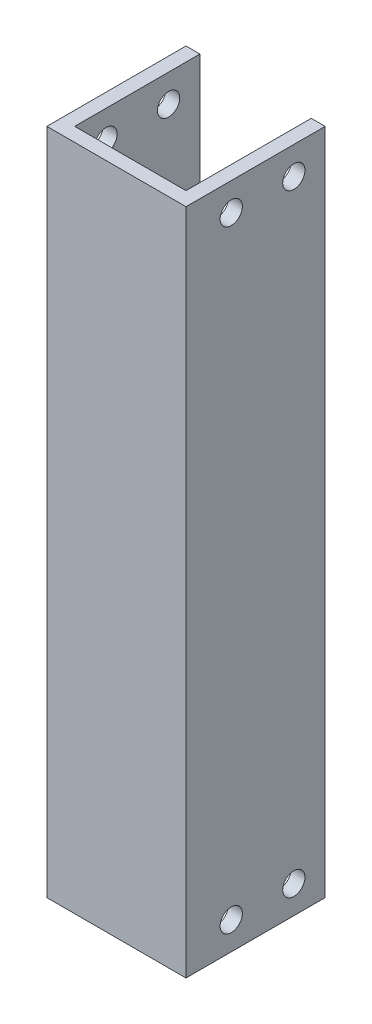
ISO-10303-21;
HEADER;
FILE_DESCRIPTION(('STEP AP214'),'2;1');
FILE_NAME('part.step','',(''),(''),'','','');
FILE_SCHEMA(('AUTOMOTIVE_DESIGN { 1 0 10303 214 1 1 1 1 }'));
ENDSEC;
DATA;
#1=APPLICATION_CONTEXT('core data for automotive mechanical design processes');
#2=APPLICATION_PROTOCOL_DEFINITION('international standard','automotive_design',2000,#1);
#3=PRODUCT_CONTEXT('',#1,'mechanical');
#4=PRODUCT('Part','Part','',(#3));
#5=PRODUCT_RELATED_PRODUCT_CATEGORY('part','',(#4));
#6=PRODUCT_DEFINITION_FORMATION('','',#4);
#7=PRODUCT_DEFINITION_CONTEXT('part definition',#1,'design');
#8=PRODUCT_DEFINITION('design','',#6,#7);
#9=PRODUCT_DEFINITION_SHAPE('','',#8);
#10=(LENGTH_UNIT() NAMED_UNIT(*) SI_UNIT(.MILLI.,.METRE.));
#11=(NAMED_UNIT(*) PLANE_ANGLE_UNIT() SI_UNIT($,.RADIAN.));
#12=(NAMED_UNIT(*) SI_UNIT($,.STERADIAN.) SOLID_ANGLE_UNIT());
#13=UNCERTAINTY_MEASURE_WITH_UNIT(LENGTH_MEASURE(1.E-05),#10,'distance_accuracy_value','');
#14=(GEOMETRIC_REPRESENTATION_CONTEXT(3) GLOBAL_UNCERTAINTY_ASSIGNED_CONTEXT((#13)) GLOBAL_UNIT_ASSIGNED_CONTEXT((#10,
#11,#12)) REPRESENTATION_CONTEXT('',''));
#15=CARTESIAN_POINT('',(0.,0.,0.));
#16=DIRECTION('',(0.,0.,1.));
#17=DIRECTION('',(1.,0.,0.));
#18=AXIS2_PLACEMENT_3D('',#15,#16,#17);
#19=CARTESIAN_POINT('',(0.,152.4,0.));
#20=DIRECTION('',(1.,0.,0.));
#21=DIRECTION('',(0.,0.,-1.));
#22=AXIS2_PLACEMENT_3D('',#19,#20,#21);
#23=PLANE('',#22);
#24=CARTESIAN_POINT('',(0.,146.05,-24.60625));
#25=DIRECTION('',(1.,0.,0.));
#26=DIRECTION('',(0.,0.,-1.));
#27=AXIS2_PLACEMENT_3D('',#24,#25,#26);
#28=CIRCLE('',#27,2.54);
#29=CARTESIAN_POINT('',(0.,146.05,-27.14625));
#30=VERTEX_POINT('',#29);
#31=EDGE_CURVE('E165',#30,#30,#28,.T.);
#32=ORIENTED_EDGE('',*,*,#31,.T.);
#33=EDGE_LOOP('',(#32));
#34=FACE_BOUND('',#33,.T.);
#35=CARTESIAN_POINT('',(0.,6.35,-10.31875));
#36=DIRECTION('',(1.,0.,0.));
#37=DIRECTION('',(0.,0.,-1.));
#38=AXIS2_PLACEMENT_3D('',#35,#36,#37);
#39=CIRCLE('',#38,2.54);
#40=CARTESIAN_POINT('',(0.,6.35,-12.85875));
#41=VERTEX_POINT('',#40);
#42=EDGE_CURVE('E237',#41,#41,#39,.T.);
#43=ORIENTED_EDGE('',*,*,#42,.T.);
#44=EDGE_LOOP('',(#43));
#45=FACE_BOUND('',#44,.T.);
#46=CARTESIAN_POINT('',(0.,146.05,-10.31875));
#47=DIRECTION('',(1.,0.,0.));
#48=DIRECTION('',(0.,0.,-1.));
#49=AXIS2_PLACEMENT_3D('',#46,#47,#48);
#50=CIRCLE('',#49,2.54);
#51=CARTESIAN_POINT('',(0.,146.05,-12.85875));
#52=VERTEX_POINT('',#51);
#53=EDGE_CURVE('E241',#52,#52,#50,.T.);
#54=ORIENTED_EDGE('',*,*,#53,.T.);
#55=EDGE_LOOP('',(#54));
#56=FACE_BOUND('',#55,.T.);
#57=CARTESIAN_POINT('',(0.,6.35,-24.60625));
#58=DIRECTION('',(1.,0.,0.));
#59=DIRECTION('',(0.,0.,-1.));
#60=AXIS2_PLACEMENT_3D('',#57,#58,#59);
#61=CIRCLE('',#60,2.54);
#62=CARTESIAN_POINT('',(0.,6.35,-27.14625));
#63=VERTEX_POINT('',#62);
#64=EDGE_CURVE('E161',#63,#63,#61,.T.);
#65=ORIENTED_EDGE('',*,*,#64,.T.);
#66=EDGE_LOOP('',(#65));
#67=FACE_BOUND('',#66,.T.);
#68=DIRECTION('',(0.,0.,1.));
#69=VECTOR('',#68,1.);
#70=CARTESIAN_POINT('',(0.,0.,0.));
#71=LINE('',#70,#69);
#72=CARTESIAN_POINT('',(0.,0.,-31.75));
#73=VERTEX_POINT('',#72);
#74=CARTESIAN_POINT('',(0.,0.,0.));
#75=VERTEX_POINT('',#74);
#76=EDGE_CURVE('E131',#73,#75,#71,.T.);
#77=ORIENTED_EDGE('',*,*,#76,.T.);
#78=DIRECTION('',(0.,-1.,0.));
#79=VECTOR('',#78,1.);
#80=CARTESIAN_POINT('',(0.,152.4,0.));
#81=LINE('',#80,#79);
#82=CARTESIAN_POINT('',(0.,152.4,0.));
#83=VERTEX_POINT('',#82);
#84=EDGE_CURVE('E11',#83,#75,#81,.T.);
#85=ORIENTED_EDGE('',*,*,#84,.F.);
#86=DIRECTION('',(0.,0.,1.));
#87=VECTOR('',#86,1.);
#88=CARTESIAN_POINT('',(0.,152.4,0.));
#89=LINE('',#88,#87);
#90=CARTESIAN_POINT('',(0.,152.4,-31.75));
#91=VERTEX_POINT('',#90);
#92=EDGE_CURVE('E146',#91,#83,#89,.T.);
#93=ORIENTED_EDGE('',*,*,#92,.F.);
#94=DIRECTION('',(0.,-1.,0.));
#95=VECTOR('',#94,1.);
#96=CARTESIAN_POINT('',(0.,152.4,-31.75));
#97=LINE('',#96,#95);
#98=EDGE_CURVE('E127',#91,#73,#97,.T.);
#99=ORIENTED_EDGE('',*,*,#98,.T.);
#100=EDGE_LOOP('',(#77,#85,#93,#99));
#101=FACE_BOUND('',#100,.T.);
#102=ADVANCED_FACE('F33',(#34,#45,#56,#67,#101),#23,.F.);
#103=CARTESIAN_POINT('',(0.,152.4,0.));
#104=DIRECTION('',(0.,0.,-1.));
#105=DIRECTION('',(-1.,0.,0.));
#106=AXIS2_PLACEMENT_3D('',#103,#104,#105);
#107=PLANE('',#106);
#108=DIRECTION('',(1.,0.,0.));
#109=VECTOR('',#108,1.);
#110=CARTESIAN_POINT('',(0.,0.,0.));
#111=LINE('',#110,#109);
#112=CARTESIAN_POINT('',(31.75,0.,0.));
#113=VERTEX_POINT('',#112);
#114=EDGE_CURVE('E134',#75,#113,#111,.T.);
#115=ORIENTED_EDGE('',*,*,#114,.T.);
#116=DIRECTION('',(0.,-1.,0.));
#117=VECTOR('',#116,1.);
#118=CARTESIAN_POINT('',(31.75,152.4,0.));
#119=LINE('',#118,#117);
#120=CARTESIAN_POINT('',(31.75,152.4,0.));
#121=VERTEX_POINT('',#120);
#122=EDGE_CURVE('E42',#121,#113,#119,.T.);
#123=ORIENTED_EDGE('',*,*,#122,.F.);
#124=DIRECTION('',(1.,0.,0.));
#125=VECTOR('',#124,1.);
#126=CARTESIAN_POINT('',(0.,152.4,0.));
#127=LINE('',#126,#125);
#128=EDGE_CURVE('E94',#83,#121,#127,.T.);
#129=ORIENTED_EDGE('',*,*,#128,.F.);
#130=ORIENTED_EDGE('',*,*,#84,.T.);
#131=EDGE_LOOP('',(#115,#123,#129,#130));
#132=FACE_BOUND('',#131,.T.);
#133=ADVANCED_FACE('F225',(#132),#107,.F.);
#134=CARTESIAN_POINT('',(31.75,152.4,0.));
#135=DIRECTION('',(-1.,0.,0.));
#136=DIRECTION('',(0.,0.,1.));
#137=AXIS2_PLACEMENT_3D('',#134,#135,#136);
#138=PLANE('',#137);
#139=CARTESIAN_POINT('',(31.75,146.05,-24.60625));
#140=DIRECTION('',(1.,0.,0.));
#141=DIRECTION('',(0.,0.,-1.));
#142=AXIS2_PLACEMENT_3D('',#139,#140,#141);
#143=CIRCLE('',#142,2.54);
#144=CARTESIAN_POINT('',(31.75,146.05,-27.14625));
#145=VERTEX_POINT('',#144);
#146=EDGE_CURVE('E297',#145,#145,#143,.T.);
#147=ORIENTED_EDGE('',*,*,#146,.F.);
#148=EDGE_LOOP('',(#147));
#149=FACE_BOUND('',#148,.T.);
#150=CARTESIAN_POINT('',(31.75,6.35,-10.31875));
#151=DIRECTION('',(1.,0.,0.));
#152=DIRECTION('',(0.,0.,-1.));
#153=AXIS2_PLACEMENT_3D('',#150,#151,#152);
#154=CIRCLE('',#153,2.54);
#155=CARTESIAN_POINT('',(31.75,6.35,-12.85875));
#156=VERTEX_POINT('',#155);
#157=EDGE_CURVE('E291',#156,#156,#154,.T.);
#158=ORIENTED_EDGE('',*,*,#157,.F.);
#159=EDGE_LOOP('',(#158));
#160=FACE_BOUND('',#159,.T.);
#161=CARTESIAN_POINT('',(31.75,146.05,-10.31875));
#162=DIRECTION('',(1.,0.,0.));
#163=DIRECTION('',(0.,0.,-1.));
#164=AXIS2_PLACEMENT_3D('',#161,#162,#163);
#165=CIRCLE('',#164,2.54);
#166=CARTESIAN_POINT('',(31.75,146.05,-12.85875));
#167=VERTEX_POINT('',#166);
#168=EDGE_CURVE('E178',#167,#167,#165,.T.);
#169=ORIENTED_EDGE('',*,*,#168,.F.);
#170=EDGE_LOOP('',(#169));
#171=FACE_BOUND('',#170,.T.);
#172=CARTESIAN_POINT('',(31.75,6.35,-24.60625));
#173=DIRECTION('',(1.,0.,0.));
#174=DIRECTION('',(0.,0.,-1.));
#175=AXIS2_PLACEMENT_3D('',#172,#173,#174);
#176=CIRCLE('',#175,2.54);
#177=CARTESIAN_POINT('',(31.75,6.35,-27.14625));
#178=VERTEX_POINT('',#177);
#179=EDGE_CURVE('E184',#178,#178,#176,.T.);
#180=ORIENTED_EDGE('',*,*,#179,.F.);
#181=EDGE_LOOP('',(#180));
#182=FACE_BOUND('',#181,.T.);
#183=DIRECTION('',(0.,0.,-1.));
#184=VECTOR('',#183,1.);
#185=CARTESIAN_POINT('',(31.75,0.,0.));
#186=LINE('',#185,#184);
#187=CARTESIAN_POINT('',(31.75,0.,-31.75));
#188=VERTEX_POINT('',#187);
#189=EDGE_CURVE('E137',#113,#188,#186,.T.);
#190=ORIENTED_EDGE('',*,*,#189,.T.);
#191=DIRECTION('',(0.,-1.,0.));
#192=VECTOR('',#191,1.);
#193=CARTESIAN_POINT('',(31.75,152.4,-31.75));
#194=LINE('',#193,#192);
#195=CARTESIAN_POINT('',(31.75,152.4,-31.75));
#196=VERTEX_POINT('',#195);
#197=EDGE_CURVE('E153',#196,#188,#194,.T.);
#198=ORIENTED_EDGE('',*,*,#197,.F.);
#199=DIRECTION('',(0.,0.,-1.));
#200=VECTOR('',#199,1.);
#201=CARTESIAN_POINT('',(31.75,152.4,0.));
#202=LINE('',#201,#200);
#203=EDGE_CURVE('E193',#121,#196,#202,.T.);
#204=ORIENTED_EDGE('',*,*,#203,.F.);
#205=ORIENTED_EDGE('',*,*,#122,.T.);
#206=EDGE_LOOP('',(#190,#198,#204,#205));
#207=FACE_BOUND('',#206,.T.);
#208=ADVANCED_FACE('F230',(#149,#160,#171,#182,#207),#138,.F.);
#209=CARTESIAN_POINT('',(31.75,152.4,-31.75));
#210=DIRECTION('',(0.,0.,1.));
#211=DIRECTION('',(1.,0.,0.));
#212=AXIS2_PLACEMENT_3D('',#209,#210,#211);
#213=PLANE('',#212);
#214=DIRECTION('',(-1.,0.,0.));
#215=VECTOR('',#214,1.);
#216=CARTESIAN_POINT('',(31.75,0.,-31.75));
#217=LINE('',#216,#215);
#218=CARTESIAN_POINT('',(28.575,0.,-31.75));
#219=VERTEX_POINT('',#218);
#220=EDGE_CURVE('E139',#188,#219,#217,.T.);
#221=ORIENTED_EDGE('',*,*,#220,.T.);
#222=DIRECTION('',(0.,-1.,0.));
#223=VECTOR('',#222,1.);
#224=CARTESIAN_POINT('',(28.575,152.4,-31.75));
#225=LINE('',#224,#223);
#226=CARTESIAN_POINT('',(28.575,152.4,-31.75));
#227=VERTEX_POINT('',#226);
#228=EDGE_CURVE('E150',#227,#219,#225,.T.);
#229=ORIENTED_EDGE('',*,*,#228,.F.);
#230=DIRECTION('',(-1.,0.,0.));
#231=VECTOR('',#230,1.);
#232=CARTESIAN_POINT('',(31.75,152.4,-31.75));
#233=LINE('',#232,#231);
#234=EDGE_CURVE('E195',#196,#227,#233,.T.);
#235=ORIENTED_EDGE('',*,*,#234,.F.);
#236=ORIENTED_EDGE('',*,*,#197,.T.);
#237=EDGE_LOOP('',(#221,#229,#235,#236));
#238=FACE_BOUND('',#237,.T.);
#239=ADVANCED_FACE('F201',(#238),#213,.F.);
#240=CARTESIAN_POINT('',(28.575,152.4,-3.175));
#241=DIRECTION('',(1.,0.,0.));
#242=DIRECTION('',(0.,0.,-1.));
#243=AXIS2_PLACEMENT_3D('',#240,#241,#242);
#244=PLANE('',#243);
#245=CARTESIAN_POINT('',(28.575,146.05,-24.60625));
#246=DIRECTION('',(1.,0.,0.));
#247=DIRECTION('',(0.,0.,-1.));
#248=AXIS2_PLACEMENT_3D('',#245,#246,#247);
#249=CIRCLE('',#248,2.54);
#250=CARTESIAN_POINT('',(28.575,146.05,-27.14625));
#251=VERTEX_POINT('',#250);
#252=EDGE_CURVE('E181',#251,#251,#249,.T.);
#253=ORIENTED_EDGE('',*,*,#252,.T.);
#254=EDGE_LOOP('',(#253));
#255=FACE_BOUND('',#254,.T.);
#256=CARTESIAN_POINT('',(28.575,6.35,-10.31875));
#257=DIRECTION('',(1.,0.,0.));
#258=DIRECTION('',(0.,0.,-1.));
#259=AXIS2_PLACEMENT_3D('',#256,#257,#258);
#260=CIRCLE('',#259,2.54);
#261=CARTESIAN_POINT('',(28.575,6.35,-12.85875));
#262=VERTEX_POINT('',#261);
#263=EDGE_CURVE('E168',#262,#262,#260,.T.);
#264=ORIENTED_EDGE('',*,*,#263,.T.);
#265=EDGE_LOOP('',(#264));
#266=FACE_BOUND('',#265,.T.);
#267=CARTESIAN_POINT('',(28.575,146.05,-10.31875));
#268=DIRECTION('',(1.,0.,0.));
#269=DIRECTION('',(0.,0.,-1.));
#270=AXIS2_PLACEMENT_3D('',#267,#268,#269);
#271=CIRCLE('',#270,2.54);
#272=CARTESIAN_POINT('',(28.575,146.05,-12.85875));
#273=VERTEX_POINT('',#272);
#274=EDGE_CURVE('E164',#273,#273,#271,.T.);
#275=ORIENTED_EDGE('',*,*,#274,.T.);
#276=EDGE_LOOP('',(#275));
#277=FACE_BOUND('',#276,.T.);
#278=CARTESIAN_POINT('',(28.575,6.35,-24.60625));
#279=DIRECTION('',(1.,0.,0.));
#280=DIRECTION('',(0.,0.,-1.));
#281=AXIS2_PLACEMENT_3D('',#278,#279,#280);
#282=CIRCLE('',#281,2.54);
#283=CARTESIAN_POINT('',(28.575,6.35,-27.14625));
#284=VERTEX_POINT('',#283);
#285=EDGE_CURVE('E135',#284,#284,#282,.T.);
#286=ORIENTED_EDGE('',*,*,#285,.T.);
#287=EDGE_LOOP('',(#286));
#288=FACE_BOUND('',#287,.T.);
#289=DIRECTION('',(0.,0.,1.));
#290=VECTOR('',#289,1.);
#291=CARTESIAN_POINT('',(28.575,0.,-3.175));
#292=LINE('',#291,#290);
#293=CARTESIAN_POINT('',(28.575,0.,-3.175));
#294=VERTEX_POINT('',#293);
#295=EDGE_CURVE('E141',#219,#294,#292,.T.);
#296=ORIENTED_EDGE('',*,*,#295,.T.);
#297=DIRECTION('',(0.,-1.,0.));
#298=VECTOR('',#297,1.);
#299=CARTESIAN_POINT('',(28.575,152.4,-3.175));
#300=LINE('',#299,#298);
#301=CARTESIAN_POINT('',(28.575,152.4,-3.175));
#302=VERTEX_POINT('',#301);
#303=EDGE_CURVE('E122',#302,#294,#300,.T.);
#304=ORIENTED_EDGE('',*,*,#303,.F.);
#305=DIRECTION('',(0.,0.,1.));
#306=VECTOR('',#305,1.);
#307=CARTESIAN_POINT('',(28.575,152.4,-3.175));
#308=LINE('',#307,#306);
#309=EDGE_CURVE('E113',#227,#302,#308,.T.);
#310=ORIENTED_EDGE('',*,*,#309,.F.);
#311=ORIENTED_EDGE('',*,*,#228,.T.);
#312=EDGE_LOOP('',(#296,#304,#310,#311));
#313=FACE_BOUND('',#312,.T.);
#314=ADVANCED_FACE('F205',(#255,#266,#277,#288,#313),#244,.F.);
#315=CARTESIAN_POINT('',(3.175,152.4,-3.175));
#316=DIRECTION('',(0.,0.,1.));
#317=DIRECTION('',(1.,0.,0.));
#318=AXIS2_PLACEMENT_3D('',#315,#316,#317);
#319=PLANE('',#318);
#320=DIRECTION('',(-1.,0.,0.));
#321=VECTOR('',#320,1.);
#322=CARTESIAN_POINT('',(3.175,0.,-3.175));
#323=LINE('',#322,#321);
#324=CARTESIAN_POINT('',(3.175,0.,-3.175));
#325=VERTEX_POINT('',#324);
#326=EDGE_CURVE('E121',#294,#325,#323,.T.);
#327=ORIENTED_EDGE('',*,*,#326,.T.);
#328=DIRECTION('',(0.,-1.,0.));
#329=VECTOR('',#328,1.);
#330=CARTESIAN_POINT('',(3.175,152.4,-3.175));
#331=LINE('',#330,#329);
#332=CARTESIAN_POINT('',(3.175,152.4,-3.175));
#333=VERTEX_POINT('',#332);
#334=EDGE_CURVE('E118',#333,#325,#331,.T.);
#335=ORIENTED_EDGE('',*,*,#334,.F.);
#336=DIRECTION('',(-1.,0.,0.));
#337=VECTOR('',#336,1.);
#338=CARTESIAN_POINT('',(3.175,152.4,-3.175));
#339=LINE('',#338,#337);
#340=EDGE_CURVE('E107',#302,#333,#339,.T.);
#341=ORIENTED_EDGE('',*,*,#340,.F.);
#342=ORIENTED_EDGE('',*,*,#303,.T.);
#343=EDGE_LOOP('',(#327,#335,#341,#342));
#344=FACE_BOUND('',#343,.T.);
#345=ADVANCED_FACE('F119',(#344),#319,.F.);
#346=CARTESIAN_POINT('',(3.175,152.4,-31.75));
#347=DIRECTION('',(-1.,0.,0.));
#348=DIRECTION('',(0.,0.,1.));
#349=AXIS2_PLACEMENT_3D('',#346,#347,#348);
#350=PLANE('',#349);
#351=CARTESIAN_POINT('',(3.175,146.05,-24.60625));
#352=DIRECTION('',(-1.,0.,0.));
#353=DIRECTION('',(0.,0.,1.));
#354=AXIS2_PLACEMENT_3D('',#351,#352,#353);
#355=CIRCLE('',#354,2.54);
#356=CARTESIAN_POINT('',(3.175,146.05,-22.06625));
#357=VERTEX_POINT('',#356);
#358=EDGE_CURVE('E36',#357,#357,#355,.T.);
#359=ORIENTED_EDGE('',*,*,#358,.T.);
#360=EDGE_LOOP('',(#359));
#361=FACE_BOUND('',#360,.T.);
#362=CARTESIAN_POINT('',(3.175,6.35,-10.31875));
#363=DIRECTION('',(-1.,0.,0.));
#364=DIRECTION('',(0.,0.,1.));
#365=AXIS2_PLACEMENT_3D('',#362,#363,#364);
#366=CIRCLE('',#365,2.54);
#367=CARTESIAN_POINT('',(3.175,6.35,-7.77875));
#368=VERTEX_POINT('',#367);
#369=EDGE_CURVE('E166',#368,#368,#366,.T.);
#370=ORIENTED_EDGE('',*,*,#369,.T.);
#371=EDGE_LOOP('',(#370));
#372=FACE_BOUND('',#371,.T.);
#373=CARTESIAN_POINT('',(3.175,146.05,-10.31875));
#374=DIRECTION('',(-1.,0.,0.));
#375=DIRECTION('',(0.,0.,1.));
#376=AXIS2_PLACEMENT_3D('',#373,#374,#375);
#377=CIRCLE('',#376,2.54);
#378=CARTESIAN_POINT('',(3.175,146.05,-7.77875));
#379=VERTEX_POINT('',#378);
#380=EDGE_CURVE('E162',#379,#379,#377,.T.);
#381=ORIENTED_EDGE('',*,*,#380,.T.);
#382=EDGE_LOOP('',(#381));
#383=FACE_BOUND('',#382,.T.);
#384=CARTESIAN_POINT('',(3.175,6.35,-24.60625));
#385=DIRECTION('',(-1.,0.,0.));
#386=DIRECTION('',(0.,0.,1.));
#387=AXIS2_PLACEMENT_3D('',#384,#385,#386);
#388=CIRCLE('',#387,2.54);
#389=CARTESIAN_POINT('',(3.175,6.35,-22.06625));
#390=VERTEX_POINT('',#389);
#391=EDGE_CURVE('E158',#390,#390,#388,.T.);
#392=ORIENTED_EDGE('',*,*,#391,.T.);
#393=EDGE_LOOP('',(#392));
#394=FACE_BOUND('',#393,.T.);
#395=DIRECTION('',(0.,0.,-1.));
#396=VECTOR('',#395,1.);
#397=CARTESIAN_POINT('',(3.175,0.,-31.75));
#398=LINE('',#397,#396);
#399=CARTESIAN_POINT('',(3.175,0.,-31.75));
#400=VERTEX_POINT('',#399);
#401=EDGE_CURVE('E80',#325,#400,#398,.T.);
#402=ORIENTED_EDGE('',*,*,#401,.T.);
#403=DIRECTION('',(0.,-1.,0.));
#404=VECTOR('',#403,1.);
#405=CARTESIAN_POINT('',(3.175,152.4,-31.75));
#406=LINE('',#405,#404);
#407=CARTESIAN_POINT('',(3.175,152.4,-31.75));
#408=VERTEX_POINT('',#407);
#409=EDGE_CURVE('E123',#408,#400,#406,.T.);
#410=ORIENTED_EDGE('',*,*,#409,.F.);
#411=DIRECTION('',(0.,0.,-1.));
#412=VECTOR('',#411,1.);
#413=CARTESIAN_POINT('',(3.175,152.4,-31.75));
#414=LINE('',#413,#412);
#415=EDGE_CURVE('E111',#333,#408,#414,.T.);
#416=ORIENTED_EDGE('',*,*,#415,.F.);
#417=ORIENTED_EDGE('',*,*,#334,.T.);
#418=EDGE_LOOP('',(#402,#410,#416,#417));
#419=FACE_BOUND('',#418,.T.);
#420=ADVANCED_FACE('F125',(#361,#372,#383,#394,#419),#350,.F.);
#421=CARTESIAN_POINT('',(0.,152.4,-31.75));
#422=DIRECTION('',(0.,0.,1.));
#423=DIRECTION('',(1.,0.,0.));
#424=AXIS2_PLACEMENT_3D('',#421,#422,#423);
#425=PLANE('',#424);
#426=DIRECTION('',(-1.,0.,0.));
#427=VECTOR('',#426,1.);
#428=CARTESIAN_POINT('',(0.,0.,-31.75));
#429=LINE('',#428,#427);
#430=EDGE_CURVE('E86',#400,#73,#429,.T.);
#431=ORIENTED_EDGE('',*,*,#430,.T.);
#432=ORIENTED_EDGE('',*,*,#98,.F.);
#433=DIRECTION('',(-1.,0.,0.));
#434=VECTOR('',#433,1.);
#435=CARTESIAN_POINT('',(0.,152.4,-31.75));
#436=LINE('',#435,#434);
#437=EDGE_CURVE('E51',#408,#91,#436,.T.);
#438=ORIENTED_EDGE('',*,*,#437,.F.);
#439=ORIENTED_EDGE('',*,*,#409,.T.);
#440=EDGE_LOOP('',(#431,#432,#438,#439));
#441=FACE_BOUND('',#440,.T.);
#442=ADVANCED_FACE('F213',(#441),#425,.F.);
#443=CARTESIAN_POINT('',(0.,152.4,0.));
#444=DIRECTION('',(0.,-1.,0.));
#445=DIRECTION('',(0.,0.,-1.));
#446=AXIS2_PLACEMENT_3D('',#443,#444,#445);
#447=PLANE('',#446);
#448=ORIENTED_EDGE('',*,*,#92,.T.);
#449=ORIENTED_EDGE('',*,*,#128,.T.);
#450=ORIENTED_EDGE('',*,*,#203,.T.);
#451=ORIENTED_EDGE('',*,*,#234,.T.);
#452=ORIENTED_EDGE('',*,*,#309,.T.);
#453=ORIENTED_EDGE('',*,*,#340,.T.);
#454=ORIENTED_EDGE('',*,*,#415,.T.);
#455=ORIENTED_EDGE('',*,*,#437,.T.);
#456=EDGE_LOOP('',(#448,#449,#450,#451,#452,#453,#454,#455));
#457=FACE_BOUND('',#456,.T.);
#458=ADVANCED_FACE('F109',(#457),#447,.F.);
#459=CARTESIAN_POINT('',(0.,0.,0.));
#460=DIRECTION('',(0.,-1.,0.));
#461=DIRECTION('',(0.,0.,-1.));
#462=AXIS2_PLACEMENT_3D('',#459,#460,#461);
#463=PLANE('',#462);
#464=ORIENTED_EDGE('',*,*,#76,.F.);
#465=ORIENTED_EDGE('',*,*,#430,.F.);
#466=ORIENTED_EDGE('',*,*,#401,.F.);
#467=ORIENTED_EDGE('',*,*,#326,.F.);
#468=ORIENTED_EDGE('',*,*,#295,.F.);
#469=ORIENTED_EDGE('',*,*,#220,.F.);
#470=ORIENTED_EDGE('',*,*,#189,.F.);
#471=ORIENTED_EDGE('',*,*,#114,.F.);
#472=EDGE_LOOP('',(#464,#465,#466,#467,#468,#469,#470,#471));
#473=FACE_BOUND('',#472,.T.);
#474=ADVANCED_FACE('F208',(#473),#463,.T.);
#475=CARTESIAN_POINT('',(0.,6.35,-24.60625));
#476=DIRECTION('',(1.,0.,0.));
#477=DIRECTION('',(0.,0.,-1.));
#478=AXIS2_PLACEMENT_3D('',#475,#476,#477);
#479=CYLINDRICAL_SURFACE('',#478,2.54);
#480=ORIENTED_EDGE('',*,*,#64,.F.);
#481=EDGE_LOOP('',(#480));
#482=FACE_BOUND('',#481,.T.);
#483=ORIENTED_EDGE('',*,*,#391,.F.);
#484=EDGE_LOOP('',(#483));
#485=FACE_BOUND('',#484,.T.);
#486=ADVANCED_FACE('F244',(#482,#485),#479,.F.);
#487=ORIENTED_EDGE('',*,*,#179,.T.);
#488=EDGE_LOOP('',(#487));
#489=FACE_BOUND('',#488,.T.);
#490=ORIENTED_EDGE('',*,*,#285,.F.);
#491=EDGE_LOOP('',(#490));
#492=FACE_BOUND('',#491,.T.);
#493=ADVANCED_FACE('F247',(#489,#492),#479,.F.);
#494=CARTESIAN_POINT('',(0.,146.05,-10.31875));
#495=DIRECTION('',(1.,0.,0.));
#496=DIRECTION('',(0.,0.,-1.));
#497=AXIS2_PLACEMENT_3D('',#494,#495,#496);
#498=CYLINDRICAL_SURFACE('',#497,2.54);
#499=ORIENTED_EDGE('',*,*,#53,.F.);
#500=EDGE_LOOP('',(#499));
#501=FACE_BOUND('',#500,.T.);
#502=ORIENTED_EDGE('',*,*,#380,.F.);
#503=EDGE_LOOP('',(#502));
#504=FACE_BOUND('',#503,.T.);
#505=ADVANCED_FACE('F255',(#501,#504),#498,.F.);
#506=CARTESIAN_POINT('',(0.,6.35,-10.31875));
#507=DIRECTION('',(1.,0.,0.));
#508=DIRECTION('',(0.,0.,-1.));
#509=AXIS2_PLACEMENT_3D('',#506,#507,#508);
#510=CYLINDRICAL_SURFACE('',#509,2.54);
#511=ORIENTED_EDGE('',*,*,#42,.F.);
#512=EDGE_LOOP('',(#511));
#513=FACE_BOUND('',#512,.T.);
#514=ORIENTED_EDGE('',*,*,#369,.F.);
#515=EDGE_LOOP('',(#514));
#516=FACE_BOUND('',#515,.T.);
#517=ADVANCED_FACE('F268',(#513,#516),#510,.F.);
#518=CARTESIAN_POINT('',(0.,146.05,-24.60625));
#519=DIRECTION('',(1.,0.,0.));
#520=DIRECTION('',(0.,0.,-1.));
#521=AXIS2_PLACEMENT_3D('',#518,#519,#520);
#522=CYLINDRICAL_SURFACE('',#521,2.54);
#523=ORIENTED_EDGE('',*,*,#31,.F.);
#524=EDGE_LOOP('',(#523));
#525=FACE_BOUND('',#524,.T.);
#526=ORIENTED_EDGE('',*,*,#358,.F.);
#527=EDGE_LOOP('',(#526));
#528=FACE_BOUND('',#527,.T.);
#529=ADVANCED_FACE('F262',(#525,#528),#522,.F.);
#530=ORIENTED_EDGE('',*,*,#168,.T.);
#531=EDGE_LOOP('',(#530));
#532=FACE_BOUND('',#531,.T.);
#533=ORIENTED_EDGE('',*,*,#274,.F.);
#534=EDGE_LOOP('',(#533));
#535=FACE_BOUND('',#534,.T.);
#536=ADVANCED_FACE('F258',(#532,#535),#498,.F.);
#537=ORIENTED_EDGE('',*,*,#157,.T.);
#538=EDGE_LOOP('',(#537));
#539=FACE_BOUND('',#538,.T.);
#540=ORIENTED_EDGE('',*,*,#263,.F.);
#541=EDGE_LOOP('',(#540));
#542=FACE_BOUND('',#541,.T.);
#543=ADVANCED_FACE('F261',(#539,#542),#510,.F.);
#544=ORIENTED_EDGE('',*,*,#146,.T.);
#545=EDGE_LOOP('',(#544));
#546=FACE_BOUND('',#545,.T.);
#547=ORIENTED_EDGE('',*,*,#252,.F.);
#548=EDGE_LOOP('',(#547));
#549=FACE_BOUND('',#548,.T.);
#550=ADVANCED_FACE('F266',(#546,#549),#522,.F.);
#551=CLOSED_SHELL('',(#102,#133,#208,#239,#314,#345,#420,#442,#458,#474,#486,#493,#505,#517,
#529,#536,#543,#550));
#552=MANIFOLD_SOLID_BREP('B2',#551);
#553=ADVANCED_BREP_SHAPE_REPRESENTATION('',(#18,#552),#14);
#554=SHAPE_DEFINITION_REPRESENTATION(#9,#553);
ENDSEC;
END-ISO-10303-21;
